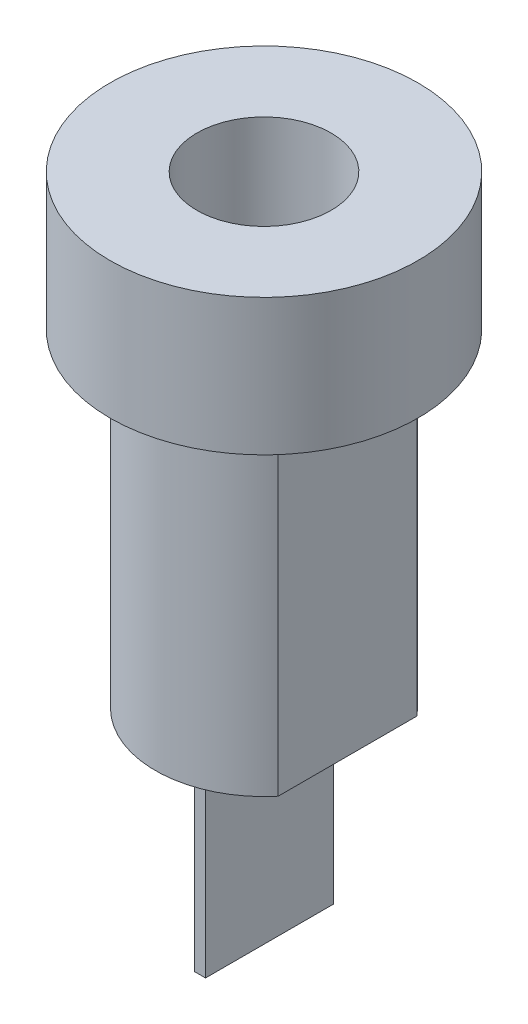
ISO-10303-21;
HEADER;
FILE_DESCRIPTION(('STEP AP214'),'2;1');
FILE_NAME('part.step','',(''),(''),'','','');
FILE_SCHEMA(('AUTOMOTIVE_DESIGN { 1 0 10303 214 1 1 1 1 }'));
ENDSEC;
DATA;
#1=APPLICATION_CONTEXT('core data for automotive mechanical design processes');
#2=APPLICATION_PROTOCOL_DEFINITION('international standard','automotive_design',2000,#1);
#3=PRODUCT_CONTEXT('',#1,'mechanical');
#4=PRODUCT('Part','Part','',(#3));
#5=PRODUCT_RELATED_PRODUCT_CATEGORY('part','',(#4));
#6=PRODUCT_DEFINITION_FORMATION('','',#4);
#7=PRODUCT_DEFINITION_CONTEXT('part definition',#1,'design');
#8=PRODUCT_DEFINITION('design','',#6,#7);
#9=PRODUCT_DEFINITION_SHAPE('','',#8);
#10=(LENGTH_UNIT() NAMED_UNIT(*) SI_UNIT(.MILLI.,.METRE.));
#11=(NAMED_UNIT(*) PLANE_ANGLE_UNIT() SI_UNIT($,.RADIAN.));
#12=(NAMED_UNIT(*) SI_UNIT($,.STERADIAN.) SOLID_ANGLE_UNIT());
#13=UNCERTAINTY_MEASURE_WITH_UNIT(LENGTH_MEASURE(1.E-05),#10,'distance_accuracy_value','');
#14=(GEOMETRIC_REPRESENTATION_CONTEXT(3) GLOBAL_UNCERTAINTY_ASSIGNED_CONTEXT((#13)) GLOBAL_UNIT_ASSIGNED_CONTEXT((#10,
#11,#12)) REPRESENTATION_CONTEXT('',''));
#15=CARTESIAN_POINT('',(0.,0.,0.));
#16=DIRECTION('',(0.,0.,1.));
#17=DIRECTION('',(1.,0.,0.));
#18=AXIS2_PLACEMENT_3D('',#15,#16,#17);
#19=CARTESIAN_POINT('',(0.,0.,3.89999999999997));
#20=DIRECTION('',(0.,1.,0.));
#21=DIRECTION('',(0.,0.,1.));
#22=AXIS2_PLACEMENT_3D('',#19,#20,#21);
#23=PLANE('',#22);
#24=CARTESIAN_POINT('',(0.,0.,0.));
#25=DIRECTION('',(0.,-1.,0.));
#26=DIRECTION('',(0.,0.,-1.));
#27=AXIS2_PLACEMENT_3D('',#24,#25,#26);
#28=CIRCLE('',#27,3.89999999999997);
#29=CARTESIAN_POINT('',(-3.,0.,-2.49198715887538));
#30=VERTEX_POINT('',#29);
#31=CARTESIAN_POINT('',(3.,0.,-2.49198715887538));
#32=VERTEX_POINT('',#31);
#33=EDGE_CURVE('E152',#30,#32,#28,.T.);
#34=ORIENTED_EDGE('',*,*,#33,.T.);
#35=DIRECTION('',(0.,0.,-1.));
#36=VECTOR('',#35,1.);
#37=CARTESIAN_POINT('',(3.,0.,-2.49198715887538));
#38=LINE('',#37,#36);
#39=CARTESIAN_POINT('',(3.,0.,2.49198715887538));
#40=VERTEX_POINT('',#39);
#41=EDGE_CURVE('E126',#40,#32,#38,.T.);
#42=ORIENTED_EDGE('',*,*,#41,.F.);
#43=CARTESIAN_POINT('',(-3.,0.,2.49198715887538));
#44=VERTEX_POINT('',#43);
#45=EDGE_CURVE('E154',#40,#44,#28,.T.);
#46=ORIENTED_EDGE('',*,*,#45,.T.);
#47=DIRECTION('',(0.,0.,1.));
#48=VECTOR('',#47,1.);
#49=CARTESIAN_POINT('',(-3.,0.,2.49198715887538));
#50=LINE('',#49,#48);
#51=EDGE_CURVE('E118',#30,#44,#50,.T.);
#52=ORIENTED_EDGE('',*,*,#51,.F.);
#53=EDGE_LOOP('',(#34,#42,#46,#52));
#54=FACE_BOUND('',#53,.T.);
#55=DIRECTION('',(0.,0.,1.));
#56=VECTOR('',#55,1.);
#57=CARTESIAN_POINT('',(0.2,0.,-2.3));
#58=LINE('',#57,#56);
#59=CARTESIAN_POINT('',(0.2,0.,-2.3));
#60=VERTEX_POINT('',#59);
#61=CARTESIAN_POINT('',(0.2,0.,2.3));
#62=VERTEX_POINT('',#61);
#63=EDGE_CURVE('E48',#60,#62,#58,.T.);
#64=ORIENTED_EDGE('',*,*,#63,.F.);
#65=DIRECTION('',(1.,0.,0.));
#66=VECTOR('',#65,1.);
#67=CARTESIAN_POINT('',(-0.2,0.,-2.3));
#68=LINE('',#67,#66);
#69=CARTESIAN_POINT('',(-0.2,0.,-2.3));
#70=VERTEX_POINT('',#69);
#71=EDGE_CURVE('E52',#70,#60,#68,.T.);
#72=ORIENTED_EDGE('',*,*,#71,.F.);
#73=DIRECTION('',(0.,0.,-1.));
#74=VECTOR('',#73,1.);
#75=CARTESIAN_POINT('',(-0.2,0.,-2.3));
#76=LINE('',#75,#74);
#77=CARTESIAN_POINT('',(-0.2,0.,2.3));
#78=VERTEX_POINT('',#77);
#79=EDGE_CURVE('E309',#78,#70,#76,.T.);
#80=ORIENTED_EDGE('',*,*,#79,.F.);
#81=DIRECTION('',(-1.,0.,0.));
#82=VECTOR('',#81,1.);
#83=CARTESIAN_POINT('',(-0.2,0.,2.3));
#84=LINE('',#83,#82);
#85=EDGE_CURVE('E315',#62,#78,#84,.T.);
#86=ORIENTED_EDGE('',*,*,#85,.F.);
#87=EDGE_LOOP('',(#64,#72,#80,#86));
#88=FACE_BOUND('',#87,.T.);
#89=ADVANCED_FACE('F33',(#54,#88),#23,.F.);
#90=CARTESIAN_POINT('',(0.,0.,0.));
#91=DIRECTION('',(0.,-1.,0.));
#92=DIRECTION('',(0.,0.,-1.));
#93=AXIS2_PLACEMENT_3D('',#90,#91,#92);
#94=CYLINDRICAL_SURFACE('',#93,3.89999999999997);
#95=CARTESIAN_POINT('',(0.,11.78,0.));
#96=DIRECTION('',(0.,-1.,0.));
#97=DIRECTION('',(0.,0.,-1.));
#98=AXIS2_PLACEMENT_3D('',#95,#96,#97);
#99=CIRCLE('',#98,3.89999999999997);
#100=CARTESIAN_POINT('',(-3.,11.78,-2.49198715887538));
#101=VERTEX_POINT('',#100);
#102=CARTESIAN_POINT('',(3.,11.78,-2.49198715887538));
#103=VERTEX_POINT('',#102);
#104=EDGE_CURVE('E155',#101,#103,#99,.T.);
#105=ORIENTED_EDGE('',*,*,#104,.T.);
#106=DIRECTION('',(0.,-1.,0.));
#107=VECTOR('',#106,1.);
#108=CARTESIAN_POINT('',(3.,16.8445829048401,-2.49198715887538));
#109=LINE('',#108,#107);
#110=EDGE_CURVE('E132',#103,#32,#109,.T.);
#111=ORIENTED_EDGE('',*,*,#110,.T.);
#112=ORIENTED_EDGE('',*,*,#33,.F.);
#113=DIRECTION('',(0.,-1.,0.));
#114=VECTOR('',#113,1.);
#115=CARTESIAN_POINT('',(-3.,16.8445829048401,-2.49198715887538));
#116=LINE('',#115,#114);
#117=EDGE_CURVE('E129',#101,#30,#116,.T.);
#118=ORIENTED_EDGE('',*,*,#117,.F.);
#119=EDGE_LOOP('',(#105,#111,#112,#118));
#120=FACE_BOUND('',#119,.T.);
#121=ADVANCED_FACE('F178',(#120),#94,.T.);
#122=CARTESIAN_POINT('',(0.,0.,0.));
#123=DIRECTION('',(0.,-1.,0.));
#124=DIRECTION('',(0.,0.,-1.));
#125=AXIS2_PLACEMENT_3D('',#122,#123,#124);
#126=CYLINDRICAL_SURFACE('',#125,5.52999999999997);
#127=CARTESIAN_POINT('',(0.,11.78,0.));
#128=DIRECTION('',(0.,-1.,0.));
#129=DIRECTION('',(0.,0.,-1.));
#130=AXIS2_PLACEMENT_3D('',#127,#128,#129);
#131=CIRCLE('',#130,5.52999999999997);
#132=CARTESIAN_POINT('',(0.,11.78,-5.52999999999997));
#133=VERTEX_POINT('',#132);
#134=EDGE_CURVE('E11',#133,#133,#131,.T.);
#135=ORIENTED_EDGE('',*,*,#134,.F.);
#136=EDGE_LOOP('',(#135));
#137=FACE_BOUND('',#136,.T.);
#138=CARTESIAN_POINT('',(0.,16.68,0.));
#139=DIRECTION('',(0.,-1.,0.));
#140=DIRECTION('',(0.,0.,-1.));
#141=AXIS2_PLACEMENT_3D('',#138,#139,#140);
#142=CIRCLE('',#141,5.52999999999997);
#143=CARTESIAN_POINT('',(0.,16.68,-5.52999999999997));
#144=VERTEX_POINT('',#143);
#145=EDGE_CURVE('E136',#144,#144,#142,.T.);
#146=ORIENTED_EDGE('',*,*,#145,.T.);
#147=EDGE_LOOP('',(#146));
#148=FACE_BOUND('',#147,.T.);
#149=ADVANCED_FACE('F35',(#137,#148),#126,.T.);
#150=CARTESIAN_POINT('',(0.,11.78,5.52999999999997));
#151=DIRECTION('',(0.,1.,0.));
#152=DIRECTION('',(0.,0.,1.));
#153=AXIS2_PLACEMENT_3D('',#150,#151,#152);
#154=PLANE('',#153);
#155=CARTESIAN_POINT('',(3.,11.78,2.49198715887538));
#156=VERTEX_POINT('',#155);
#157=CARTESIAN_POINT('',(-3.,11.78,2.49198715887538));
#158=VERTEX_POINT('',#157);
#159=EDGE_CURVE('E41',#156,#158,#99,.T.);
#160=ORIENTED_EDGE('',*,*,#159,.F.);
#161=DIRECTION('',(0.,0.,-1.));
#162=VECTOR('',#161,1.);
#163=CARTESIAN_POINT('',(3.,11.78,-2.49198715887538));
#164=LINE('',#163,#162);
#165=EDGE_CURVE('E128',#156,#103,#164,.T.);
#166=ORIENTED_EDGE('',*,*,#165,.T.);
#167=ORIENTED_EDGE('',*,*,#104,.F.);
#168=DIRECTION('',(0.,0.,1.));
#169=VECTOR('',#168,1.);
#170=CARTESIAN_POINT('',(-3.,11.78,2.49198715887538));
#171=LINE('',#170,#169);
#172=EDGE_CURVE('E120',#101,#158,#171,.T.);
#173=ORIENTED_EDGE('',*,*,#172,.T.);
#174=EDGE_LOOP('',(#160,#166,#167,#173));
#175=FACE_BOUND('',#174,.T.);
#176=ORIENTED_EDGE('',*,*,#134,.T.);
#177=EDGE_LOOP('',(#176));
#178=FACE_BOUND('',#177,.T.);
#179=ADVANCED_FACE('F174',(#175,#178),#154,.F.);
#180=ORIENTED_EDGE('',*,*,#45,.F.);
#181=DIRECTION('',(0.,-1.,0.));
#182=VECTOR('',#181,1.);
#183=CARTESIAN_POINT('',(3.,16.8445829048401,2.49198715887538));
#184=LINE('',#183,#182);
#185=EDGE_CURVE('E135',#156,#40,#184,.T.);
#186=ORIENTED_EDGE('',*,*,#185,.F.);
#187=ORIENTED_EDGE('',*,*,#159,.T.);
#188=DIRECTION('',(0.,-1.,0.));
#189=VECTOR('',#188,1.);
#190=CARTESIAN_POINT('',(-3.,16.8445829048401,2.49198715887538));
#191=LINE('',#190,#189);
#192=EDGE_CURVE('E140',#158,#44,#191,.T.);
#193=ORIENTED_EDGE('',*,*,#192,.T.);
#194=EDGE_LOOP('',(#180,#186,#187,#193));
#195=FACE_BOUND('',#194,.T.);
#196=ADVANCED_FACE('F169',(#195),#94,.T.);
#197=CARTESIAN_POINT('',(0.,11.78,2.41));
#198=DIRECTION('',(0.,-1.,0.));
#199=DIRECTION('',(0.,0.,-1.));
#200=AXIS2_PLACEMENT_3D('',#197,#198,#199);
#201=PLANE('',#200);
#202=CARTESIAN_POINT('',(0.,11.78,0.));
#203=DIRECTION('',(0.,-1.,0.));
#204=DIRECTION('',(0.,0.,-1.));
#205=AXIS2_PLACEMENT_3D('',#202,#203,#204);
#206=CIRCLE('',#205,2.41);
#207=CARTESIAN_POINT('',(0.,11.78,-2.41));
#208=VERTEX_POINT('',#207);
#209=EDGE_CURVE('E149',#208,#208,#206,.T.);
#210=ORIENTED_EDGE('',*,*,#209,.F.);
#211=EDGE_LOOP('',(#210));
#212=FACE_BOUND('',#211,.T.);
#213=ADVANCED_FACE('F188',(#212),#201,.F.);
#214=CARTESIAN_POINT('',(0.,0.,0.));
#215=DIRECTION('',(0.,-1.,0.));
#216=DIRECTION('',(0.,0.,-1.));
#217=AXIS2_PLACEMENT_3D('',#214,#215,#216);
#218=CYLINDRICAL_SURFACE('',#217,2.41);
#219=CARTESIAN_POINT('',(0.,16.68,0.));
#220=DIRECTION('',(0.,-1.,0.));
#221=DIRECTION('',(0.,0.,-1.));
#222=AXIS2_PLACEMENT_3D('',#219,#220,#221);
#223=CIRCLE('',#222,2.41);
#224=CARTESIAN_POINT('',(0.,16.68,-2.41));
#225=VERTEX_POINT('',#224);
#226=EDGE_CURVE('E146',#225,#225,#223,.T.);
#227=ORIENTED_EDGE('',*,*,#226,.F.);
#228=EDGE_LOOP('',(#227));
#229=FACE_BOUND('',#228,.T.);
#230=ORIENTED_EDGE('',*,*,#209,.T.);
#231=EDGE_LOOP('',(#230));
#232=FACE_BOUND('',#231,.T.);
#233=ADVANCED_FACE('F193',(#229,#232),#218,.F.);
#234=CARTESIAN_POINT('',(0.,16.68,2.41));
#235=DIRECTION('',(0.,-1.,0.));
#236=DIRECTION('',(0.,0.,-1.));
#237=AXIS2_PLACEMENT_3D('',#234,#235,#236);
#238=PLANE('',#237);
#239=ORIENTED_EDGE('',*,*,#145,.F.);
#240=EDGE_LOOP('',(#239));
#241=FACE_BOUND('',#240,.T.);
#242=ORIENTED_EDGE('',*,*,#226,.T.);
#243=EDGE_LOOP('',(#242));
#244=FACE_BOUND('',#243,.T.);
#245=ADVANCED_FACE('F219',(#241,#244),#238,.F.);
#246=CARTESIAN_POINT('',(-3.,16.8445829048401,2.49198715887538));
#247=DIRECTION('',(1.,0.,0.));
#248=DIRECTION('',(0.,0.,-1.));
#249=AXIS2_PLACEMENT_3D('',#246,#247,#248);
#250=PLANE('',#249);
#251=ORIENTED_EDGE('',*,*,#117,.T.);
#252=ORIENTED_EDGE('',*,*,#51,.T.);
#253=ORIENTED_EDGE('',*,*,#192,.F.);
#254=ORIENTED_EDGE('',*,*,#172,.F.);
#255=EDGE_LOOP('',(#251,#252,#253,#254));
#256=FACE_BOUND('',#255,.T.);
#257=ADVANCED_FACE('F172',(#256),#250,.F.);
#258=CARTESIAN_POINT('',(3.,16.8445829048401,-2.49198715887538));
#259=DIRECTION('',(-1.,0.,0.));
#260=DIRECTION('',(0.,0.,1.));
#261=AXIS2_PLACEMENT_3D('',#258,#259,#260);
#262=PLANE('',#261);
#263=ORIENTED_EDGE('',*,*,#185,.T.);
#264=ORIENTED_EDGE('',*,*,#41,.T.);
#265=ORIENTED_EDGE('',*,*,#110,.F.);
#266=ORIENTED_EDGE('',*,*,#165,.F.);
#267=EDGE_LOOP('',(#263,#264,#265,#266));
#268=FACE_BOUND('',#267,.T.);
#269=ADVANCED_FACE('F177',(#268),#262,.F.);
#270=CARTESIAN_POINT('',(0.2,-7.15,-2.3));
#271=DIRECTION('',(-1.,0.,0.));
#272=DIRECTION('',(0.,0.,1.));
#273=AXIS2_PLACEMENT_3D('',#270,#271,#272);
#274=PLANE('',#273);
#275=ORIENTED_EDGE('',*,*,#63,.T.);
#276=DIRECTION('',(0.,1.,0.));
#277=VECTOR('',#276,1.);
#278=CARTESIAN_POINT('',(0.2,-7.15,2.3));
#279=LINE('',#278,#277);
#280=CARTESIAN_POINT('',(0.2,-7.15,2.3));
#281=VERTEX_POINT('',#280);
#282=EDGE_CURVE('E101',#281,#62,#279,.T.);
#283=ORIENTED_EDGE('',*,*,#282,.F.);
#284=DIRECTION('',(0.,0.,1.));
#285=VECTOR('',#284,1.);
#286=CARTESIAN_POINT('',(0.2,-7.15,-2.3));
#287=LINE('',#286,#285);
#288=CARTESIAN_POINT('',(0.2,-7.15,-2.3));
#289=VERTEX_POINT('',#288);
#290=EDGE_CURVE('E107',#289,#281,#287,.T.);
#291=ORIENTED_EDGE('',*,*,#290,.F.);
#292=DIRECTION('',(0.,1.,0.));
#293=VECTOR('',#292,1.);
#294=CARTESIAN_POINT('',(0.2,-7.15,-2.3));
#295=LINE('',#294,#293);
#296=EDGE_CURVE('E307',#289,#60,#295,.T.);
#297=ORIENTED_EDGE('',*,*,#296,.T.);
#298=EDGE_LOOP('',(#275,#283,#291,#297));
#299=FACE_BOUND('',#298,.T.);
#300=ADVANCED_FACE('F117',(#299),#274,.F.);
#301=CARTESIAN_POINT('',(-0.2,-7.15,2.3));
#302=DIRECTION('',(0.,0.,-1.));
#303=DIRECTION('',(-1.,0.,0.));
#304=AXIS2_PLACEMENT_3D('',#301,#302,#303);
#305=PLANE('',#304);
#306=ORIENTED_EDGE('',*,*,#85,.T.);
#307=DIRECTION('',(0.,1.,0.));
#308=VECTOR('',#307,1.);
#309=CARTESIAN_POINT('',(-0.2,-7.15,2.3));
#310=LINE('',#309,#308);
#311=CARTESIAN_POINT('',(-0.2,-7.15,2.3));
#312=VERTEX_POINT('',#311);
#313=EDGE_CURVE('E103',#312,#78,#310,.T.);
#314=ORIENTED_EDGE('',*,*,#313,.F.);
#315=DIRECTION('',(-1.,0.,0.));
#316=VECTOR('',#315,1.);
#317=CARTESIAN_POINT('',(-0.2,-7.15,2.3));
#318=LINE('',#317,#316);
#319=EDGE_CURVE('E96',#281,#312,#318,.T.);
#320=ORIENTED_EDGE('',*,*,#319,.F.);
#321=ORIENTED_EDGE('',*,*,#282,.T.);
#322=EDGE_LOOP('',(#306,#314,#320,#321));
#323=FACE_BOUND('',#322,.T.);
#324=ADVANCED_FACE('F99',(#323),#305,.F.);
#325=CARTESIAN_POINT('',(-0.2,-7.15,-2.3));
#326=DIRECTION('',(1.,0.,0.));
#327=DIRECTION('',(0.,0.,-1.));
#328=AXIS2_PLACEMENT_3D('',#325,#326,#327);
#329=PLANE('',#328);
#330=ORIENTED_EDGE('',*,*,#79,.T.);
#331=DIRECTION('',(0.,1.,0.));
#332=VECTOR('',#331,1.);
#333=CARTESIAN_POINT('',(-0.2,-7.15,-2.3));
#334=LINE('',#333,#332);
#335=CARTESIAN_POINT('',(-0.2,-7.15,-2.3));
#336=VERTEX_POINT('',#335);
#337=EDGE_CURVE('E122',#336,#70,#334,.T.);
#338=ORIENTED_EDGE('',*,*,#337,.F.);
#339=DIRECTION('',(0.,0.,-1.));
#340=VECTOR('',#339,1.);
#341=CARTESIAN_POINT('',(-0.2,-7.15,-2.3));
#342=LINE('',#341,#340);
#343=EDGE_CURVE('E106',#312,#336,#342,.T.);
#344=ORIENTED_EDGE('',*,*,#343,.F.);
#345=ORIENTED_EDGE('',*,*,#313,.T.);
#346=EDGE_LOOP('',(#330,#338,#344,#345));
#347=FACE_BOUND('',#346,.T.);
#348=ADVANCED_FACE('F273',(#347),#329,.F.);
#349=CARTESIAN_POINT('',(-0.2,-7.15,-2.3));
#350=DIRECTION('',(0.,0.,1.));
#351=DIRECTION('',(1.,0.,0.));
#352=AXIS2_PLACEMENT_3D('',#349,#350,#351);
#353=PLANE('',#352);
#354=ORIENTED_EDGE('',*,*,#71,.T.);
#355=ORIENTED_EDGE('',*,*,#296,.F.);
#356=DIRECTION('',(1.,0.,0.));
#357=VECTOR('',#356,1.);
#358=CARTESIAN_POINT('',(-0.2,-7.15,-2.3));
#359=LINE('',#358,#357);
#360=EDGE_CURVE('E112',#336,#289,#359,.T.);
#361=ORIENTED_EDGE('',*,*,#360,.F.);
#362=ORIENTED_EDGE('',*,*,#337,.T.);
#363=EDGE_LOOP('',(#354,#355,#361,#362));
#364=FACE_BOUND('',#363,.T.);
#365=ADVANCED_FACE('F281',(#364),#353,.F.);
#366=CARTESIAN_POINT('',(0.,-7.15,0.));
#367=DIRECTION('',(0.,1.,0.));
#368=DIRECTION('',(0.,0.,1.));
#369=AXIS2_PLACEMENT_3D('',#366,#367,#368);
#370=PLANE('',#369);
#371=ORIENTED_EDGE('',*,*,#290,.T.);
#372=ORIENTED_EDGE('',*,*,#319,.T.);
#373=ORIENTED_EDGE('',*,*,#343,.T.);
#374=ORIENTED_EDGE('',*,*,#360,.T.);
#375=EDGE_LOOP('',(#371,#372,#373,#374));
#376=FACE_BOUND('',#375,.T.);
#377=ADVANCED_FACE('F110',(#376),#370,.F.);
#378=CLOSED_SHELL('',(#89,#121,#149,#179,#196,#213,#233,#245,#257,#269,#300,#324,#348,#365,#377));
#379=MANIFOLD_SOLID_BREP('B2',#378);
#380=ADVANCED_BREP_SHAPE_REPRESENTATION('',(#18,#379),#14);
#381=SHAPE_DEFINITION_REPRESENTATION(#9,#380);
ENDSEC;
END-ISO-10303-21;
